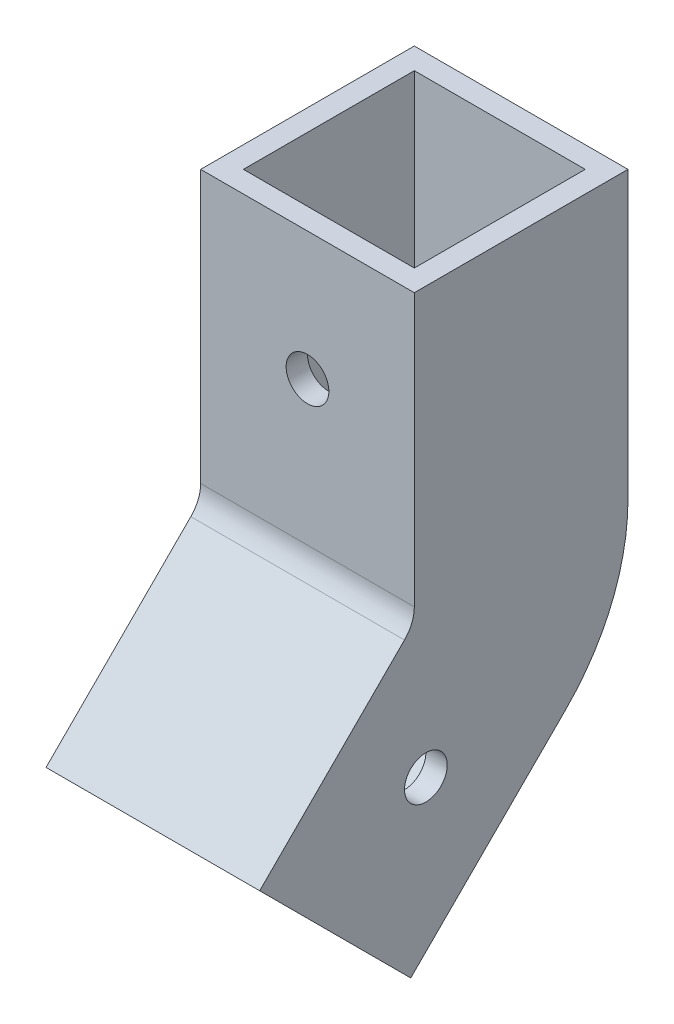
ISO-10303-21;
HEADER;
FILE_DESCRIPTION(('STEP AP214'),'2;1');
FILE_NAME('part.step','',(''),(''),'','','');
FILE_SCHEMA(('AUTOMOTIVE_DESIGN { 1 0 10303 214 1 1 1 1 }'));
ENDSEC;
DATA;
#1=APPLICATION_CONTEXT('core data for automotive mechanical design processes');
#2=APPLICATION_PROTOCOL_DEFINITION('international standard','automotive_design',2000,#1);
#3=PRODUCT_CONTEXT('',#1,'mechanical');
#4=PRODUCT('Part','Part','',(#3));
#5=PRODUCT_RELATED_PRODUCT_CATEGORY('part','',(#4));
#6=PRODUCT_DEFINITION_FORMATION('','',#4);
#7=PRODUCT_DEFINITION_CONTEXT('part definition',#1,'design');
#8=PRODUCT_DEFINITION('design','',#6,#7);
#9=PRODUCT_DEFINITION_SHAPE('','',#8);
#10=(LENGTH_UNIT() NAMED_UNIT(*) SI_UNIT(.MILLI.,.METRE.));
#11=(NAMED_UNIT(*) PLANE_ANGLE_UNIT() SI_UNIT($,.RADIAN.));
#12=(NAMED_UNIT(*) SI_UNIT($,.STERADIAN.) SOLID_ANGLE_UNIT());
#13=UNCERTAINTY_MEASURE_WITH_UNIT(LENGTH_MEASURE(1.E-05),#10,'distance_accuracy_value','');
#14=(GEOMETRIC_REPRESENTATION_CONTEXT(3) GLOBAL_UNCERTAINTY_ASSIGNED_CONTEXT((#13)) GLOBAL_UNIT_ASSIGNED_CONTEXT((#10,
#11,#12)) REPRESENTATION_CONTEXT('',''));
#15=CARTESIAN_POINT('',(0.,0.,0.));
#16=DIRECTION('',(0.,0.,1.));
#17=DIRECTION('',(1.,0.,0.));
#18=AXIS2_PLACEMENT_3D('',#15,#16,#17);
#19=CARTESIAN_POINT('',(124.79784655193,-20.2055762724056,-4.33057627240575));
#20=DIRECTION('',(0.,-0.707106781186545,-0.70710678118655));
#21=DIRECTION('',(0.,0.70710678118655,-0.707106781186545));
#22=AXIS2_PLACEMENT_3D('',#19,#20,#21);
#23=PLANE('',#22);
#24=DIRECTION('',(0.,0.70710678118655,-0.707106781186545));
#25=VECTOR('',#24,1.);
#26=CARTESIAN_POINT('',(28.575,-20.2055762724056,-4.33057627240575));
#27=LINE('',#26,#25);
#28=CARTESIAN_POINT('',(28.575,-43.1865466609685,18.6503941161569));
#29=VERTEX_POINT('',#28);
#30=CARTESIAN_POINT('',(28.575,-20.2055762724056,-4.33057627240577));
#31=VERTEX_POINT('',#30);
#32=EDGE_CURVE('E198',#29,#31,#27,.T.);
#33=ORIENTED_EDGE('',*,*,#32,.T.);
#34=DIRECTION('',(-1.,0.,0.));
#35=VECTOR('',#34,1.);
#36=CARTESIAN_POINT('',(124.79784655193,-20.2055762724056,-4.33057627240577));
#37=LINE('',#36,#35);
#38=CARTESIAN_POINT('',(3.175,-20.2055762724056,-4.33057627240577));
#39=VERTEX_POINT('',#38);
#40=EDGE_CURVE('E156',#31,#39,#37,.T.);
#41=ORIENTED_EDGE('',*,*,#40,.T.);
#42=DIRECTION('',(0.,-0.70710678118655,0.707106781186545));
#43=VECTOR('',#42,1.);
#44=CARTESIAN_POINT('',(3.175,-20.2055762724056,-4.33057627240575));
#45=LINE('',#44,#43);
#46=CARTESIAN_POINT('',(3.175,-43.1865466609685,18.6503941161569));
#47=VERTEX_POINT('',#46);
#48=EDGE_CURVE('E150',#39,#47,#45,.T.);
#49=ORIENTED_EDGE('',*,*,#48,.T.);
#50=DIRECTION('',(1.,0.,0.));
#51=VECTOR('',#50,1.);
#52=CARTESIAN_POINT('',(3.175,-43.1865466609685,18.6503941161569));
#53=LINE('',#52,#51);
#54=EDGE_CURVE('E153',#47,#29,#53,.T.);
#55=ORIENTED_EDGE('',*,*,#54,.T.);
#56=EDGE_LOOP('',(#33,#41,#49,#55));
#57=FACE_BOUND('',#56,.T.);
#58=ADVANCED_FACE('F39',(#57),#23,.F.);
#59=CARTESIAN_POINT('',(124.79784655193,0.,15.8750000000005));
#60=DIRECTION('',(-1.,0.,0.));
#61=DIRECTION('',(0.,0.,1.));
#62=AXIS2_PLACEMENT_3D('',#59,#60,#61);
#63=CYLINDRICAL_SURFACE('',#62,28.5750000000005);
#64=CARTESIAN_POINT('',(28.575,0.,15.8750000000005));
#65=DIRECTION('',(-1.,0.,0.));
#66=DIRECTION('',(0.,0.,1.));
#67=AXIS2_PLACEMENT_3D('',#64,#65,#66);
#68=CIRCLE('',#67,28.5750000000005);
#69=CARTESIAN_POINT('',(28.575,0.,-12.7));
#70=VERTEX_POINT('',#69);
#71=EDGE_CURVE('E196',#31,#70,#68,.F.);
#72=ORIENTED_EDGE('',*,*,#71,.T.);
#73=DIRECTION('',(-1.,0.,0.));
#74=VECTOR('',#73,1.);
#75=CARTESIAN_POINT('',(124.79784655193,0.,-12.7));
#76=LINE('',#75,#74);
#77=CARTESIAN_POINT('',(3.175,0.,-12.7));
#78=VERTEX_POINT('',#77);
#79=EDGE_CURVE('E209',#70,#78,#76,.T.);
#80=ORIENTED_EDGE('',*,*,#79,.T.);
#81=CARTESIAN_POINT('',(3.175,0.,15.8750000000005));
#82=DIRECTION('',(-1.,0.,0.));
#83=DIRECTION('',(0.,0.,1.));
#84=AXIS2_PLACEMENT_3D('',#81,#82,#83);
#85=CIRCLE('',#84,28.5750000000005);
#86=EDGE_CURVE('E207',#78,#39,#85,.T.);
#87=ORIENTED_EDGE('',*,*,#86,.T.);
#88=ORIENTED_EDGE('',*,*,#40,.F.);
#89=EDGE_LOOP('',(#72,#80,#87,#88));
#90=FACE_BOUND('',#89,.T.);
#91=ADVANCED_FACE('F321',(#90),#63,.F.);
#92=CARTESIAN_POINT('',(124.79784655193,39.325,-12.7));
#93=DIRECTION('',(0.,0.,-1.));
#94=DIRECTION('',(-1.,0.,0.));
#95=AXIS2_PLACEMENT_3D('',#92,#93,#94);
#96=PLANE('',#95);
#97=CARTESIAN_POINT('',(15.875,23.45,-12.7));
#98=DIRECTION('',(0.,0.,-1.));
#99=DIRECTION('',(-1.,0.,0.));
#100=AXIS2_PLACEMENT_3D('',#97,#98,#99);
#101=CIRCLE('',#100,3.175);
#102=CARTESIAN_POINT('',(12.7,23.45,-12.7));
#103=VERTEX_POINT('',#102);
#104=EDGE_CURVE('E580',#103,#103,#101,.T.);
#105=ORIENTED_EDGE('',*,*,#104,.T.);
#106=EDGE_LOOP('',(#105));
#107=FACE_BOUND('',#106,.T.);
#108=DIRECTION('',(0.,1.,0.));
#109=VECTOR('',#108,1.);
#110=CARTESIAN_POINT('',(28.575,39.325,-12.7));
#111=LINE('',#110,#109);
#112=CARTESIAN_POINT('',(28.575,42.5,-12.7));
#113=VERTEX_POINT('',#112);
#114=EDGE_CURVE('E194',#70,#113,#111,.T.);
#115=ORIENTED_EDGE('',*,*,#114,.T.);
#116=DIRECTION('',(-1.,0.,0.));
#117=VECTOR('',#116,1.);
#118=CARTESIAN_POINT('',(28.575,42.5,-12.7));
#119=LINE('',#118,#117);
#120=CARTESIAN_POINT('',(3.175,42.5,-12.7));
#121=VERTEX_POINT('',#120);
#122=EDGE_CURVE('E160',#113,#121,#119,.T.);
#123=ORIENTED_EDGE('',*,*,#122,.T.);
#124=DIRECTION('',(0.,-1.,0.));
#125=VECTOR('',#124,1.);
#126=CARTESIAN_POINT('',(3.175,39.325,-12.7));
#127=LINE('',#126,#125);
#128=EDGE_CURVE('E204',#121,#78,#127,.T.);
#129=ORIENTED_EDGE('',*,*,#128,.T.);
#130=ORIENTED_EDGE('',*,*,#79,.F.);
#131=EDGE_LOOP('',(#115,#123,#129,#130));
#132=FACE_BOUND('',#131,.T.);
#133=ADVANCED_FACE('F326',(#107,#132),#96,.F.);
#134=CARTESIAN_POINT('',(124.79784655193,-1.31512806053458,12.7));
#135=DIRECTION('',(0.,0.,1.));
#136=DIRECTION('',(1.,0.,0.));
#137=AXIS2_PLACEMENT_3D('',#134,#135,#136);
#138=PLANE('',#137);
#139=CARTESIAN_POINT('',(15.875,23.45,12.7));
#140=DIRECTION('',(0.,0.,1.));
#141=DIRECTION('',(1.,0.,0.));
#142=AXIS2_PLACEMENT_3D('',#139,#140,#141);
#143=CIRCLE('',#142,3.175);
#144=CARTESIAN_POINT('',(19.05,23.45,12.7));
#145=VERTEX_POINT('',#144);
#146=EDGE_CURVE('E576',#145,#145,#143,.T.);
#147=ORIENTED_EDGE('',*,*,#146,.T.);
#148=EDGE_LOOP('',(#147));
#149=FACE_BOUND('',#148,.T.);
#150=DIRECTION('',(0.,-1.,0.));
#151=VECTOR('',#150,1.);
#152=CARTESIAN_POINT('',(28.575,-1.31512806053458,12.7));
#153=LINE('',#152,#151);
#154=CARTESIAN_POINT('',(28.575,42.5,12.7));
#155=VERTEX_POINT('',#154);
#156=CARTESIAN_POINT('',(28.575,0.755939751330876,12.7));
#157=VERTEX_POINT('',#156);
#158=EDGE_CURVE('E191',#155,#157,#153,.T.);
#159=ORIENTED_EDGE('',*,*,#158,.T.);
#160=DIRECTION('',(-1.,0.,0.));
#161=VECTOR('',#160,1.);
#162=CARTESIAN_POINT('',(124.79784655193,0.755939751330876,12.7));
#163=LINE('',#162,#161);
#164=CARTESIAN_POINT('',(3.175,0.755939751330876,12.7));
#165=VERTEX_POINT('',#164);
#166=EDGE_CURVE('E264',#157,#165,#163,.T.);
#167=ORIENTED_EDGE('',*,*,#166,.T.);
#168=DIRECTION('',(0.,1.,0.));
#169=VECTOR('',#168,1.);
#170=CARTESIAN_POINT('',(3.175,-1.31512806053458,12.7));
#171=LINE('',#170,#169);
#172=CARTESIAN_POINT('',(3.175,42.5,12.7));
#173=VERTEX_POINT('',#172);
#174=EDGE_CURVE('E202',#165,#173,#171,.T.);
#175=ORIENTED_EDGE('',*,*,#174,.T.);
#176=DIRECTION('',(1.,0.,0.));
#177=VECTOR('',#176,1.);
#178=CARTESIAN_POINT('',(3.175,42.5,12.7));
#179=LINE('',#178,#177);
#180=EDGE_CURVE('E181',#173,#155,#179,.T.);
#181=ORIENTED_EDGE('',*,*,#180,.T.);
#182=EDGE_LOOP('',(#159,#167,#175,#181));
#183=FACE_BOUND('',#182,.T.);
#184=ADVANCED_FACE('F471',(#149,#183),#138,.F.);
#185=CARTESIAN_POINT('',(124.79784655193,-22.9809703885629,34.3658423280281));
#186=DIRECTION('',(0.,0.707106781186543,0.707106781186552));
#187=DIRECTION('',(0.,-0.707106781186552,0.707106781186543));
#188=AXIS2_PLACEMENT_3D('',#185,#186,#187);
#189=PLANE('',#188);
#190=DIRECTION('',(0.,0.707106781186552,-0.707106781186543));
#191=VECTOR('',#190,1.);
#192=CARTESIAN_POINT('',(3.175,-22.9809703885629,34.3658423280281));
#193=LINE('',#192,#191);
#194=CARTESIAN_POINT('',(3.175,-25.2260344188302,36.6109063582954));
#195=VERTEX_POINT('',#194);
#196=CARTESIAN_POINT('',(3.175,-2.77959415460185,14.1644660940672));
#197=VERTEX_POINT('',#196);
#198=EDGE_CURVE('E159',#195,#197,#193,.T.);
#199=ORIENTED_EDGE('',*,*,#198,.T.);
#200=DIRECTION('',(-1.,0.,0.));
#201=VECTOR('',#200,1.);
#202=CARTESIAN_POINT('',(124.79784655193,-2.77959415460184,14.1644660940672));
#203=LINE('',#202,#201);
#204=CARTESIAN_POINT('',(28.575,-2.77959415460184,14.1644660940672));
#205=VERTEX_POINT('',#204);
#206=EDGE_CURVE('E60',#197,#205,#203,.F.);
#207=ORIENTED_EDGE('',*,*,#206,.T.);
#208=DIRECTION('',(0.,-0.707106781186552,0.707106781186543));
#209=VECTOR('',#208,1.);
#210=CARTESIAN_POINT('',(28.575,-22.9809703885629,34.3658423280281));
#211=LINE('',#210,#209);
#212=CARTESIAN_POINT('',(28.575,-25.2260344188302,36.6109063582954));
#213=VERTEX_POINT('',#212);
#214=EDGE_CURVE('E189',#205,#213,#211,.T.);
#215=ORIENTED_EDGE('',*,*,#214,.T.);
#216=DIRECTION('',(-1.,0.,0.));
#217=VECTOR('',#216,1.);
#218=CARTESIAN_POINT('',(28.575,-25.2260344188302,36.6109063582954));
#219=LINE('',#218,#217);
#220=EDGE_CURVE('E168',#213,#195,#219,.T.);
#221=ORIENTED_EDGE('',*,*,#220,.T.);
#222=EDGE_LOOP('',(#199,#207,#215,#221));
#223=FACE_BOUND('',#222,.T.);
#224=ADVANCED_FACE('F331',(#223),#189,.F.);
#225=CARTESIAN_POINT('',(3.175,0.,15.8750000000005));
#226=DIRECTION('',(-1.,0.,0.));
#227=DIRECTION('',(0.,0.,1.));
#228=AXIS2_PLACEMENT_3D('',#225,#226,#227);
#229=PLANE('',#228);
#230=CARTESIAN_POINT('',(3.175,-20.7359063582957,14.1602660556225));
#231=DIRECTION('',(-1.,0.,0.));
#232=DIRECTION('',(0.,0.,1.));
#233=AXIS2_PLACEMENT_3D('',#230,#231,#232);
#234=CIRCLE('',#233,3.175);
#235=CARTESIAN_POINT('',(3.175,-20.7359063582957,17.3352660556225));
#236=VERTEX_POINT('',#235);
#237=EDGE_CURVE('E583',#236,#236,#234,.T.);
#238=ORIENTED_EDGE('',*,*,#237,.T.);
#239=EDGE_LOOP('',(#238));
#240=FACE_BOUND('',#239,.T.);
#241=ORIENTED_EDGE('',*,*,#48,.F.);
#242=ORIENTED_EDGE('',*,*,#86,.F.);
#243=ORIENTED_EDGE('',*,*,#128,.F.);
#244=DIRECTION('',(0.,0.,1.));
#245=VECTOR('',#244,1.);
#246=CARTESIAN_POINT('',(3.175,42.5,-12.7));
#247=LINE('',#246,#245);
#248=EDGE_CURVE('E175',#121,#173,#247,.T.);
#249=ORIENTED_EDGE('',*,*,#248,.T.);
#250=ORIENTED_EDGE('',*,*,#174,.F.);
#251=CARTESIAN_POINT('',(3.175,0.755939751330876,17.7));
#252=DIRECTION('',(-1.,0.,0.));
#253=DIRECTION('',(0.,0.,1.));
#254=AXIS2_PLACEMENT_3D('',#251,#252,#253);
#255=CIRCLE('',#254,5.);
#256=EDGE_CURVE('E47',#165,#197,#255,.T.);
#257=ORIENTED_EDGE('',*,*,#256,.T.);
#258=ORIENTED_EDGE('',*,*,#198,.F.);
#259=DIRECTION('',(0.,-0.707106781186543,-0.707106781186552));
#260=VECTOR('',#259,1.);
#261=CARTESIAN_POINT('',(3.175,-25.2260344188302,36.6109063582954));
#262=LINE('',#261,#260);
#263=EDGE_CURVE('E163',#195,#47,#262,.T.);
#264=ORIENTED_EDGE('',*,*,#263,.T.);
#265=EDGE_LOOP('',(#241,#242,#243,#249,#250,#257,#258,#264));
#266=FACE_BOUND('',#265,.T.);
#267=ADVANCED_FACE('F164',(#240,#266),#229,.F.);
#268=CARTESIAN_POINT('',(28.575,0.,15.8750000000005));
#269=DIRECTION('',(-1.,0.,0.));
#270=DIRECTION('',(0.,0.,1.));
#271=AXIS2_PLACEMENT_3D('',#268,#269,#270);
#272=PLANE('',#271);
#273=CARTESIAN_POINT('',(28.575,-20.7359063582957,14.1602660556225));
#274=DIRECTION('',(-1.,0.,0.));
#275=DIRECTION('',(0.,0.,1.));
#276=AXIS2_PLACEMENT_3D('',#273,#274,#275);
#277=CIRCLE('',#276,3.175);
#278=CARTESIAN_POINT('',(28.575,-20.7359063582957,17.3352660556225));
#279=VERTEX_POINT('',#278);
#280=EDGE_CURVE('E604',#279,#279,#277,.T.);
#281=ORIENTED_EDGE('',*,*,#280,.F.);
#282=EDGE_LOOP('',(#281));
#283=FACE_BOUND('',#282,.T.);
#284=ORIENTED_EDGE('',*,*,#32,.F.);
#285=DIRECTION('',(0.,0.707106781186543,0.707106781186552));
#286=VECTOR('',#285,1.);
#287=CARTESIAN_POINT('',(28.575,-43.1865466609685,18.6503941161569));
#288=LINE('',#287,#286);
#289=EDGE_CURVE('E173',#29,#213,#288,.T.);
#290=ORIENTED_EDGE('',*,*,#289,.T.);
#291=ORIENTED_EDGE('',*,*,#214,.F.);
#292=CARTESIAN_POINT('',(28.575,0.755939751330876,17.7));
#293=DIRECTION('',(-1.,0.,0.));
#294=DIRECTION('',(0.,0.,1.));
#295=AXIS2_PLACEMENT_3D('',#292,#293,#294);
#296=CIRCLE('',#295,5.);
#297=EDGE_CURVE('E12',#205,#157,#296,.F.);
#298=ORIENTED_EDGE('',*,*,#297,.T.);
#299=ORIENTED_EDGE('',*,*,#158,.F.);
#300=DIRECTION('',(0.,0.,-1.));
#301=VECTOR('',#300,1.);
#302=CARTESIAN_POINT('',(28.575,42.5,12.7));
#303=LINE('',#302,#301);
#304=EDGE_CURVE('E184',#155,#113,#303,.T.);
#305=ORIENTED_EDGE('',*,*,#304,.T.);
#306=ORIENTED_EDGE('',*,*,#114,.F.);
#307=ORIENTED_EDGE('',*,*,#71,.F.);
#308=EDGE_LOOP('',(#284,#290,#291,#298,#299,#305,#306,#307));
#309=FACE_BOUND('',#308,.T.);
#310=ADVANCED_FACE('F441',(#283,#309),#272,.T.);
#311=CARTESIAN_POINT('',(31.75,42.5,15.875));
#312=DIRECTION('',(0.,0.,-1.));
#313=DIRECTION('',(-1.,0.,0.));
#314=AXIS2_PLACEMENT_3D('',#311,#312,#313);
#315=PLANE('',#314);
#316=CARTESIAN_POINT('',(15.875,23.45,15.875));
#317=DIRECTION('',(0.,0.,-1.));
#318=DIRECTION('',(-1.,0.,0.));
#319=AXIS2_PLACEMENT_3D('',#316,#317,#318);
#320=CIRCLE('',#319,3.175);
#321=CARTESIAN_POINT('',(12.7,23.45,15.875));
#322=VERTEX_POINT('',#321);
#323=EDGE_CURVE('E575',#322,#322,#320,.F.);
#324=ORIENTED_EDGE('',*,*,#323,.F.);
#325=EDGE_LOOP('',(#324));
#326=FACE_BOUND('',#325,.T.);
#327=DIRECTION('',(0.,-1.,0.));
#328=VECTOR('',#327,1.);
#329=CARTESIAN_POINT('',(0.,42.5,15.875));
#330=LINE('',#329,#328);
#331=CARTESIAN_POINT('',(0.,42.5,15.875));
#332=VERTEX_POINT('',#331);
#333=CARTESIAN_POINT('',(0.,2.07106781186544,15.875));
#334=VERTEX_POINT('',#333);
#335=EDGE_CURVE('E199',#332,#334,#330,.T.);
#336=ORIENTED_EDGE('',*,*,#335,.T.);
#337=DIRECTION('',(-1.,0.,0.));
#338=VECTOR('',#337,1.);
#339=CARTESIAN_POINT('',(31.75,2.07106781186544,15.875));
#340=LINE('',#339,#338);
#341=CARTESIAN_POINT('',(31.75,2.07106781186544,15.875));
#342=VERTEX_POINT('',#341);
#343=EDGE_CURVE('E262',#334,#342,#340,.F.);
#344=ORIENTED_EDGE('',*,*,#343,.T.);
#345=DIRECTION('',(0.,-1.,0.));
#346=VECTOR('',#345,1.);
#347=CARTESIAN_POINT('',(31.75,42.5,15.875));
#348=LINE('',#347,#346);
#349=CARTESIAN_POINT('',(31.75,42.5,15.875));
#350=VERTEX_POINT('',#349);
#351=EDGE_CURVE('E212',#350,#342,#348,.T.);
#352=ORIENTED_EDGE('',*,*,#351,.F.);
#353=DIRECTION('',(-1.,0.,0.));
#354=VECTOR('',#353,1.);
#355=CARTESIAN_POINT('',(31.75,42.5,15.875));
#356=LINE('',#355,#354);
#357=EDGE_CURVE('E228',#350,#332,#356,.T.);
#358=ORIENTED_EDGE('',*,*,#357,.T.);
#359=EDGE_LOOP('',(#336,#344,#352,#358));
#360=FACE_BOUND('',#359,.T.);
#361=ADVANCED_FACE('F291',(#326,#360),#315,.F.);
#362=CARTESIAN_POINT('',(31.75,-22.980970388563,38.8559703885627));
#363=DIRECTION('',(0.,-0.707106781186543,-0.707106781186552));
#364=DIRECTION('',(0.,0.707106781186552,-0.707106781186543));
#365=AXIS2_PLACEMENT_3D('',#362,#363,#364);
#366=PLANE('',#365);
#367=DIRECTION('',(0.,-0.707106781186552,0.707106781186543));
#368=VECTOR('',#367,1.);
#369=CARTESIAN_POINT('',(31.75,-22.980970388563,38.8559703885627));
#370=LINE('',#369,#368);
#371=CARTESIAN_POINT('',(31.75,-1.46446609406728,17.3394660940672));
#372=VERTEX_POINT('',#371);
#373=CARTESIAN_POINT('',(31.75,-22.980970388563,38.8559703885627));
#374=VERTEX_POINT('',#373);
#375=EDGE_CURVE('E215',#372,#374,#370,.T.);
#376=ORIENTED_EDGE('',*,*,#375,.F.);
#377=DIRECTION('',(-1.,0.,0.));
#378=VECTOR('',#377,1.);
#379=CARTESIAN_POINT('',(0.,-1.46446609406727,17.3394660940672));
#380=LINE('',#379,#378);
#381=CARTESIAN_POINT('',(0.,-1.46446609406728,17.3394660940672));
#382=VERTEX_POINT('',#381);
#383=EDGE_CURVE('E259',#372,#382,#380,.T.);
#384=ORIENTED_EDGE('',*,*,#383,.T.);
#385=DIRECTION('',(0.,-0.707106781186552,0.707106781186543));
#386=VECTOR('',#385,1.);
#387=CARTESIAN_POINT('',(0.,-22.980970388563,38.8559703885627));
#388=LINE('',#387,#386);
#389=CARTESIAN_POINT('',(0.,-22.980970388563,38.8559703885627));
#390=VERTEX_POINT('',#389);
#391=EDGE_CURVE('E231',#382,#390,#388,.T.);
#392=ORIENTED_EDGE('',*,*,#391,.T.);
#393=DIRECTION('',(-1.,0.,0.));
#394=VECTOR('',#393,1.);
#395=CARTESIAN_POINT('',(31.75,-22.980970388563,38.8559703885627));
#396=LINE('',#395,#394);
#397=EDGE_CURVE('E256',#374,#390,#396,.T.);
#398=ORIENTED_EDGE('',*,*,#397,.F.);
#399=EDGE_LOOP('',(#376,#384,#392,#398));
#400=FACE_BOUND('',#399,.T.);
#401=ADVANCED_FACE('F281',(#400),#366,.F.);
#402=CARTESIAN_POINT('',(31.75,-45.4316106912357,16.4053300858896));
#403=DIRECTION('',(0.,0.707106781186552,-0.707106781186543));
#404=DIRECTION('',(0.,0.707106781186543,0.707106781186552));
#405=AXIS2_PLACEMENT_3D('',#402,#403,#404);
#406=PLANE('',#405);
#407=ORIENTED_EDGE('',*,*,#263,.F.);
#408=ORIENTED_EDGE('',*,*,#220,.F.);
#409=ORIENTED_EDGE('',*,*,#289,.F.);
#410=ORIENTED_EDGE('',*,*,#54,.F.);
#411=EDGE_LOOP('',(#407,#408,#409,#410));
#412=FACE_BOUND('',#411,.T.);
#413=DIRECTION('',(0.,-0.707106781186543,-0.707106781186552));
#414=VECTOR('',#413,1.);
#415=CARTESIAN_POINT('',(0.,-45.4316106912357,16.4053300858896));
#416=LINE('',#415,#414);
#417=CARTESIAN_POINT('',(0.,-45.4316106912357,16.4053300858896));
#418=VERTEX_POINT('',#417);
#419=EDGE_CURVE('E233',#390,#418,#416,.T.);
#420=ORIENTED_EDGE('',*,*,#419,.T.);
#421=DIRECTION('',(-1.,0.,0.));
#422=VECTOR('',#421,1.);
#423=CARTESIAN_POINT('',(31.75,-45.4316106912357,16.4053300858896));
#424=LINE('',#423,#422);
#425=CARTESIAN_POINT('',(31.75,-45.4316106912357,16.4053300858896));
#426=VERTEX_POINT('',#425);
#427=EDGE_CURVE('E253',#426,#418,#424,.T.);
#428=ORIENTED_EDGE('',*,*,#427,.F.);
#429=DIRECTION('',(0.,-0.707106781186543,-0.707106781186552));
#430=VECTOR('',#429,1.);
#431=CARTESIAN_POINT('',(31.75,-45.4316106912357,16.4053300858896));
#432=LINE('',#431,#430);
#433=EDGE_CURVE('E218',#374,#426,#432,.T.);
#434=ORIENTED_EDGE('',*,*,#433,.F.);
#435=ORIENTED_EDGE('',*,*,#397,.T.);
#436=EDGE_LOOP('',(#420,#428,#434,#435));
#437=FACE_BOUND('',#436,.T.);
#438=ADVANCED_FACE('F170',(#412,#437),#406,.F.);
#439=CARTESIAN_POINT('',(31.75,-45.4316106912357,16.4053300858896));
#440=DIRECTION('',(0.,0.707106781186542,0.707106781186553));
#441=DIRECTION('',(0.,-0.707106781186553,0.707106781186542));
#442=AXIS2_PLACEMENT_3D('',#439,#440,#441);
#443=PLANE('',#442);
#444=DIRECTION('',(0.,0.707106781186553,-0.707106781186542));
#445=VECTOR('',#444,1.);
#446=CARTESIAN_POINT('',(0.,-45.4316106912357,16.4053300858896));
#447=LINE('',#446,#445);
#448=CARTESIAN_POINT('',(0.,-22.4506403026728,-6.57564030267305));
#449=VERTEX_POINT('',#448);
#450=EDGE_CURVE('E235',#418,#449,#447,.T.);
#451=ORIENTED_EDGE('',*,*,#450,.T.);
#452=DIRECTION('',(-1.,0.,0.));
#453=VECTOR('',#452,1.);
#454=CARTESIAN_POINT('',(31.75,-22.4506403026728,-6.57564030267305));
#455=LINE('',#454,#453);
#456=CARTESIAN_POINT('',(31.75,-22.4506403026728,-6.57564030267305));
#457=VERTEX_POINT('',#456);
#458=EDGE_CURVE('E250',#457,#449,#455,.T.);
#459=ORIENTED_EDGE('',*,*,#458,.F.);
#460=DIRECTION('',(0.,0.707106781186553,-0.707106781186542));
#461=VECTOR('',#460,1.);
#462=CARTESIAN_POINT('',(31.75,-45.4316106912357,16.4053300858896));
#463=LINE('',#462,#461);
#464=EDGE_CURVE('E220',#426,#457,#463,.T.);
#465=ORIENTED_EDGE('',*,*,#464,.F.);
#466=ORIENTED_EDGE('',*,*,#427,.T.);
#467=EDGE_LOOP('',(#451,#459,#465,#466));
#468=FACE_BOUND('',#467,.T.);
#469=ADVANCED_FACE('F310',(#468),#443,.F.);
#470=CARTESIAN_POINT('',(31.75,0.,15.8750000000005));
#471=DIRECTION('',(-1.,0.,0.));
#472=DIRECTION('',(0.,0.,1.));
#473=AXIS2_PLACEMENT_3D('',#470,#471,#472);
#474=CYLINDRICAL_SURFACE('',#473,31.7500000000004);
#475=CARTESIAN_POINT('',(0.,0.,15.8750000000005));
#476=DIRECTION('',(1.,0.,0.));
#477=DIRECTION('',(0.,0.,1.));
#478=AXIS2_PLACEMENT_3D('',#475,#476,#477);
#479=CIRCLE('',#478,31.7500000000004);
#480=CARTESIAN_POINT('',(0.,0.,-15.875));
#481=VERTEX_POINT('',#480);
#482=EDGE_CURVE('E237',#449,#481,#479,.T.);
#483=ORIENTED_EDGE('',*,*,#482,.T.);
#484=DIRECTION('',(-1.,0.,0.));
#485=VECTOR('',#484,1.);
#486=CARTESIAN_POINT('',(31.75,0.,-15.875));
#487=LINE('',#486,#485);
#488=CARTESIAN_POINT('',(31.75,0.,-15.875));
#489=VERTEX_POINT('',#488);
#490=EDGE_CURVE('E247',#489,#481,#487,.T.);
#491=ORIENTED_EDGE('',*,*,#490,.F.);
#492=CARTESIAN_POINT('',(31.75,0.,15.8750000000005));
#493=DIRECTION('',(1.,0.,0.));
#494=DIRECTION('',(0.,0.,1.));
#495=AXIS2_PLACEMENT_3D('',#492,#493,#494);
#496=CIRCLE('',#495,31.7500000000004);
#497=EDGE_CURVE('E222',#457,#489,#496,.T.);
#498=ORIENTED_EDGE('',*,*,#497,.F.);
#499=ORIENTED_EDGE('',*,*,#458,.T.);
#500=EDGE_LOOP('',(#483,#491,#498,#499));
#501=FACE_BOUND('',#500,.T.);
#502=ADVANCED_FACE('F306',(#501),#474,.T.);
#503=CARTESIAN_POINT('',(31.75,42.5,-15.875));
#504=DIRECTION('',(0.,0.,1.));
#505=DIRECTION('',(1.,0.,0.));
#506=AXIS2_PLACEMENT_3D('',#503,#504,#505);
#507=PLANE('',#506);
#508=CARTESIAN_POINT('',(15.875,23.45,-15.875));
#509=DIRECTION('',(0.,0.,-1.));
#510=DIRECTION('',(-1.,0.,0.));
#511=AXIS2_PLACEMENT_3D('',#508,#509,#510);
#512=CIRCLE('',#511,3.175);
#513=CARTESIAN_POINT('',(12.7,23.45,-15.875));
#514=VERTEX_POINT('',#513);
#515=EDGE_CURVE('E577',#514,#514,#512,.T.);
#516=ORIENTED_EDGE('',*,*,#515,.F.);
#517=EDGE_LOOP('',(#516));
#518=FACE_BOUND('',#517,.T.);
#519=DIRECTION('',(0.,1.,0.));
#520=VECTOR('',#519,1.);
#521=CARTESIAN_POINT('',(0.,42.5,-15.875));
#522=LINE('',#521,#520);
#523=CARTESIAN_POINT('',(0.,42.5,-15.875));
#524=VERTEX_POINT('',#523);
#525=EDGE_CURVE('E239',#481,#524,#522,.T.);
#526=ORIENTED_EDGE('',*,*,#525,.T.);
#527=DIRECTION('',(-1.,0.,0.));
#528=VECTOR('',#527,1.);
#529=CARTESIAN_POINT('',(31.75,42.5,-15.875));
#530=LINE('',#529,#528);
#531=CARTESIAN_POINT('',(31.75,42.5,-15.875));
#532=VERTEX_POINT('',#531);
#533=EDGE_CURVE('E244',#532,#524,#530,.T.);
#534=ORIENTED_EDGE('',*,*,#533,.F.);
#535=DIRECTION('',(0.,1.,0.));
#536=VECTOR('',#535,1.);
#537=CARTESIAN_POINT('',(31.75,42.5,-15.875));
#538=LINE('',#537,#536);
#539=EDGE_CURVE('E224',#489,#532,#538,.T.);
#540=ORIENTED_EDGE('',*,*,#539,.F.);
#541=ORIENTED_EDGE('',*,*,#490,.T.);
#542=EDGE_LOOP('',(#526,#534,#540,#541));
#543=FACE_BOUND('',#542,.T.);
#544=ADVANCED_FACE('F301',(#518,#543),#507,.F.);
#545=CARTESIAN_POINT('',(31.75,42.5,-15.875));
#546=DIRECTION('',(0.,-1.,0.));
#547=DIRECTION('',(0.,0.,-1.));
#548=AXIS2_PLACEMENT_3D('',#545,#546,#547);
#549=PLANE('',#548);
#550=ORIENTED_EDGE('',*,*,#180,.F.);
#551=ORIENTED_EDGE('',*,*,#248,.F.);
#552=ORIENTED_EDGE('',*,*,#122,.F.);
#553=ORIENTED_EDGE('',*,*,#304,.F.);
#554=EDGE_LOOP('',(#550,#551,#552,#553));
#555=FACE_BOUND('',#554,.T.);
#556=DIRECTION('',(0.,0.,1.));
#557=VECTOR('',#556,1.);
#558=CARTESIAN_POINT('',(0.,42.5,-15.875));
#559=LINE('',#558,#557);
#560=EDGE_CURVE('E216',#524,#332,#559,.T.);
#561=ORIENTED_EDGE('',*,*,#560,.T.);
#562=ORIENTED_EDGE('',*,*,#357,.F.);
#563=DIRECTION('',(0.,0.,1.));
#564=VECTOR('',#563,1.);
#565=CARTESIAN_POINT('',(31.75,42.5,-15.875));
#566=LINE('',#565,#564);
#567=EDGE_CURVE('E226',#532,#350,#566,.T.);
#568=ORIENTED_EDGE('',*,*,#567,.F.);
#569=ORIENTED_EDGE('',*,*,#533,.T.);
#570=EDGE_LOOP('',(#561,#562,#568,#569));
#571=FACE_BOUND('',#570,.T.);
#572=ADVANCED_FACE('F295',(#555,#571),#549,.F.);
#573=CARTESIAN_POINT('',(31.75,0.,15.8750000000005));
#574=DIRECTION('',(-1.,0.,0.));
#575=DIRECTION('',(0.,0.,1.));
#576=AXIS2_PLACEMENT_3D('',#573,#574,#575);
#577=PLANE('',#576);
#578=CARTESIAN_POINT('',(31.75,-20.7359063582957,14.1602660556225));
#579=DIRECTION('',(1.,0.,0.));
#580=DIRECTION('',(0.,0.,-1.));
#581=AXIS2_PLACEMENT_3D('',#578,#579,#580);
#582=CIRCLE('',#581,3.175);
#583=CARTESIAN_POINT('',(31.75,-20.7359063582957,10.9852660556225));
#584=VERTEX_POINT('',#583);
#585=EDGE_CURVE('E610',#584,#584,#582,.T.);
#586=ORIENTED_EDGE('',*,*,#585,.F.);
#587=EDGE_LOOP('',(#586));
#588=FACE_BOUND('',#587,.T.);
#589=ORIENTED_EDGE('',*,*,#351,.T.);
#590=CARTESIAN_POINT('',(31.75,2.07106781186544,20.875));
#591=DIRECTION('',(-1.,0.,0.));
#592=DIRECTION('',(0.,0.,1.));
#593=AXIS2_PLACEMENT_3D('',#590,#591,#592);
#594=CIRCLE('',#593,5.);
#595=EDGE_CURVE('E270',#342,#372,#594,.T.);
#596=ORIENTED_EDGE('',*,*,#595,.T.);
#597=ORIENTED_EDGE('',*,*,#375,.T.);
#598=ORIENTED_EDGE('',*,*,#433,.T.);
#599=ORIENTED_EDGE('',*,*,#464,.T.);
#600=ORIENTED_EDGE('',*,*,#497,.T.);
#601=ORIENTED_EDGE('',*,*,#539,.T.);
#602=ORIENTED_EDGE('',*,*,#567,.T.);
#603=EDGE_LOOP('',(#589,#596,#597,#598,#599,#600,#601,#602));
#604=FACE_BOUND('',#603,.T.);
#605=ADVANCED_FACE('F274',(#588,#604),#577,.F.);
#606=CARTESIAN_POINT('',(0.,0.,15.8750000000005));
#607=DIRECTION('',(-1.,0.,0.));
#608=DIRECTION('',(0.,0.,1.));
#609=AXIS2_PLACEMENT_3D('',#606,#607,#608);
#610=PLANE('',#609);
#611=CARTESIAN_POINT('',(0.,-20.7359063582957,14.1602660556225));
#612=DIRECTION('',(-1.,0.,0.));
#613=DIRECTION('',(0.,0.,1.));
#614=AXIS2_PLACEMENT_3D('',#611,#612,#613);
#615=CIRCLE('',#614,3.175);
#616=CARTESIAN_POINT('',(0.,-20.7359063582957,17.3352660556225));
#617=VERTEX_POINT('',#616);
#618=EDGE_CURVE('E607',#617,#617,#615,.F.);
#619=ORIENTED_EDGE('',*,*,#618,.T.);
#620=EDGE_LOOP('',(#619));
#621=FACE_BOUND('',#620,.T.);
#622=ORIENTED_EDGE('',*,*,#335,.F.);
#623=ORIENTED_EDGE('',*,*,#560,.F.);
#624=ORIENTED_EDGE('',*,*,#525,.F.);
#625=ORIENTED_EDGE('',*,*,#482,.F.);
#626=ORIENTED_EDGE('',*,*,#450,.F.);
#627=ORIENTED_EDGE('',*,*,#419,.F.);
#628=ORIENTED_EDGE('',*,*,#391,.F.);
#629=CARTESIAN_POINT('',(0.,2.07106781186544,20.875));
#630=DIRECTION('',(-1.,0.,0.));
#631=DIRECTION('',(0.,0.,1.));
#632=AXIS2_PLACEMENT_3D('',#629,#630,#631);
#633=CIRCLE('',#632,5.);
#634=EDGE_CURVE('E268',#382,#334,#633,.F.);
#635=ORIENTED_EDGE('',*,*,#634,.T.);
#636=EDGE_LOOP('',(#622,#623,#624,#625,#626,#627,#628,#635));
#637=FACE_BOUND('',#636,.T.);
#638=ADVANCED_FACE('F287',(#621,#637),#610,.T.);
#639=CARTESIAN_POINT('',(31.75,2.07106781186544,20.875));
#640=DIRECTION('',(1.,0.,0.));
#641=DIRECTION('',(0.,0.,-1.));
#642=AXIS2_PLACEMENT_3D('',#639,#640,#641);
#643=CYLINDRICAL_SURFACE('',#642,5.);
#644=ORIENTED_EDGE('',*,*,#595,.F.);
#645=ORIENTED_EDGE('',*,*,#343,.F.);
#646=ORIENTED_EDGE('',*,*,#634,.F.);
#647=ORIENTED_EDGE('',*,*,#383,.F.);
#648=EDGE_LOOP('',(#644,#645,#646,#647));
#649=FACE_BOUND('',#648,.T.);
#650=ADVANCED_FACE('F284',(#649),#643,.F.);
#651=CARTESIAN_POINT('',(124.79784655193,0.755939751330876,17.7));
#652=DIRECTION('',(-1.,0.,0.));
#653=DIRECTION('',(0.,0.,1.));
#654=AXIS2_PLACEMENT_3D('',#651,#652,#653);
#655=CYLINDRICAL_SURFACE('',#654,5.);
#656=ORIENTED_EDGE('',*,*,#297,.F.);
#657=ORIENTED_EDGE('',*,*,#206,.F.);
#658=ORIENTED_EDGE('',*,*,#256,.F.);
#659=ORIENTED_EDGE('',*,*,#166,.F.);
#660=EDGE_LOOP('',(#656,#657,#658,#659));
#661=FACE_BOUND('',#660,.T.);
#662=ADVANCED_FACE('F41',(#661),#655,.T.);
#663=CARTESIAN_POINT('',(15.875,23.45,24.8552561210692));
#664=DIRECTION('',(0.,0.,-1.));
#665=DIRECTION('',(-1.,0.,0.));
#666=AXIS2_PLACEMENT_3D('',#663,#664,#665);
#667=CYLINDRICAL_SURFACE('',#666,3.175);
#668=ORIENTED_EDGE('',*,*,#515,.T.);
#669=EDGE_LOOP('',(#668));
#670=FACE_BOUND('',#669,.T.);
#671=ORIENTED_EDGE('',*,*,#104,.F.);
#672=EDGE_LOOP('',(#671));
#673=FACE_BOUND('',#672,.T.);
#674=ADVANCED_FACE('F383',(#670,#673),#667,.F.);
#675=ORIENTED_EDGE('',*,*,#323,.T.);
#676=EDGE_LOOP('',(#675));
#677=FACE_BOUND('',#676,.T.);
#678=ORIENTED_EDGE('',*,*,#146,.F.);
#679=EDGE_LOOP('',(#678));
#680=FACE_BOUND('',#679,.T.);
#681=ADVANCED_FACE('F390',(#677,#680),#667,.F.);
#682=CARTESIAN_POINT('',(-8.98025612106915,-20.7359063582957,14.1602660556225));
#683=DIRECTION('',(1.,0.,0.));
#684=DIRECTION('',(0.,0.,-1.));
#685=AXIS2_PLACEMENT_3D('',#682,#683,#684);
#686=CYLINDRICAL_SURFACE('',#685,3.175);
#687=ORIENTED_EDGE('',*,*,#618,.F.);
#688=EDGE_LOOP('',(#687));
#689=FACE_BOUND('',#688,.T.);
#690=ORIENTED_EDGE('',*,*,#237,.F.);
#691=EDGE_LOOP('',(#690));
#692=FACE_BOUND('',#691,.T.);
#693=ADVANCED_FACE('F398',(#689,#692),#686,.F.);
#694=ORIENTED_EDGE('',*,*,#280,.T.);
#695=EDGE_LOOP('',(#694));
#696=FACE_BOUND('',#695,.T.);
#697=ORIENTED_EDGE('',*,*,#585,.T.);
#698=EDGE_LOOP('',(#697));
#699=FACE_BOUND('',#698,.T.);
#700=ADVANCED_FACE('F405',(#696,#699),#686,.F.);
#701=CLOSED_SHELL('',(#58,#91,#133,#184,#224,#267,#310,#361,#401,#438,#469,#502,#544,#572,#605,
#638,#650,#662,#674,#681,#693,#700));
#702=MANIFOLD_SOLID_BREP('B2',#701);
#703=ADVANCED_BREP_SHAPE_REPRESENTATION('',(#18,#702),#14);
#704=SHAPE_DEFINITION_REPRESENTATION(#9,#703);
ENDSEC;
END-ISO-10303-21;
